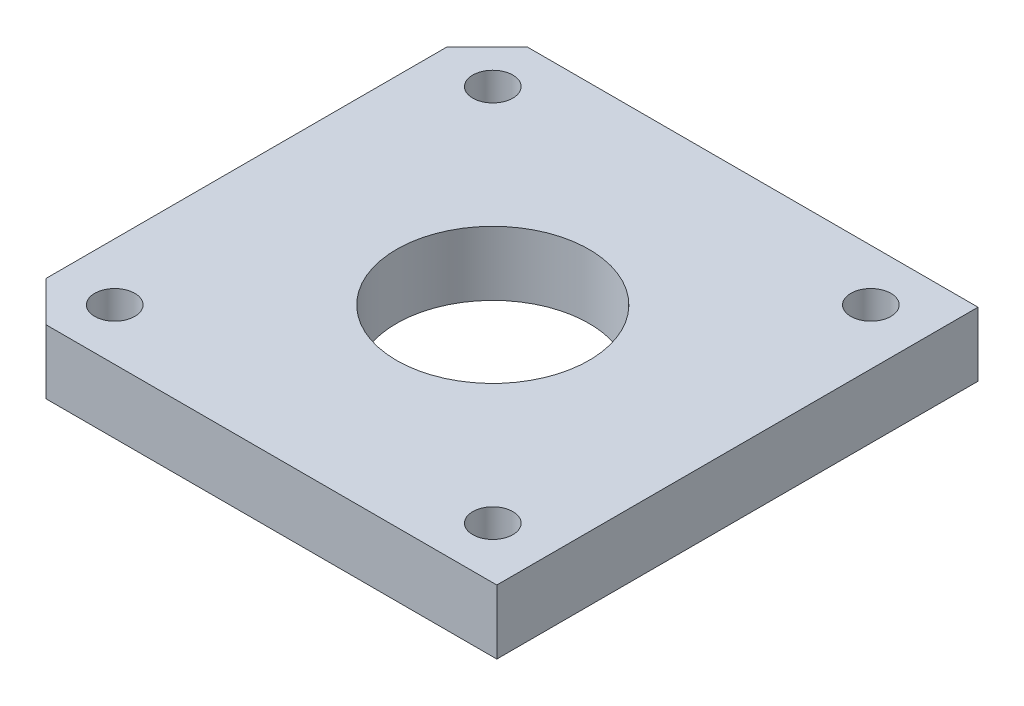
ISO-10303-21;
HEADER;
FILE_DESCRIPTION(('STEP AP214'),'2;1');
FILE_NAME('part.step','',(''),(''),'','','');
FILE_SCHEMA(('AUTOMOTIVE_DESIGN { 1 0 10303 214 1 1 1 1 }'));
ENDSEC;
DATA;
#1=APPLICATION_CONTEXT('core data for automotive mechanical design processes');
#2=APPLICATION_PROTOCOL_DEFINITION('international standard','automotive_design',2000,#1);
#3=PRODUCT_CONTEXT('',#1,'mechanical');
#4=PRODUCT('Part','Part','',(#3));
#5=PRODUCT_RELATED_PRODUCT_CATEGORY('part','',(#4));
#6=PRODUCT_DEFINITION_FORMATION('','',#4);
#7=PRODUCT_DEFINITION_CONTEXT('part definition',#1,'design');
#8=PRODUCT_DEFINITION('design','',#6,#7);
#9=PRODUCT_DEFINITION_SHAPE('','',#8);
#10=(LENGTH_UNIT() NAMED_UNIT(*) SI_UNIT(.MILLI.,.METRE.));
#11=(NAMED_UNIT(*) PLANE_ANGLE_UNIT() SI_UNIT($,.RADIAN.));
#12=(NAMED_UNIT(*) SI_UNIT($,.STERADIAN.) SOLID_ANGLE_UNIT());
#13=UNCERTAINTY_MEASURE_WITH_UNIT(LENGTH_MEASURE(1.E-05),#10,'distance_accuracy_value','');
#14=(GEOMETRIC_REPRESENTATION_CONTEXT(3) GLOBAL_UNCERTAINTY_ASSIGNED_CONTEXT((#13)) GLOBAL_UNIT_ASSIGNED_CONTEXT((#10,
#11,#12)) REPRESENTATION_CONTEXT('',''));
#15=CARTESIAN_POINT('',(0.,0.,0.));
#16=DIRECTION('',(0.,0.,1.));
#17=DIRECTION('',(1.,0.,0.));
#18=AXIS2_PLACEMENT_3D('',#15,#16,#17);
#19=CARTESIAN_POINT('',(42.5,8.,30.));
#20=DIRECTION('',(-1.,0.,0.));
#21=DIRECTION('',(0.,0.,1.));
#22=AXIS2_PLACEMENT_3D('',#19,#20,#21);
#23=PLANE('',#22);
#24=DIRECTION('',(0.,0.,-1.));
#25=VECTOR('',#24,1.);
#26=CARTESIAN_POINT('',(42.5,0.,30.));
#27=LINE('',#26,#25);
#28=CARTESIAN_POINT('',(42.5,0.,30.));
#29=VERTEX_POINT('',#28);
#30=CARTESIAN_POINT('',(42.5,0.,-30.));
#31=VERTEX_POINT('',#30);
#32=EDGE_CURVE('E103',#29,#31,#27,.T.);
#33=ORIENTED_EDGE('',*,*,#32,.T.);
#34=DIRECTION('',(0.,-1.,0.));
#35=VECTOR('',#34,1.);
#36=CARTESIAN_POINT('',(42.5,8.,-30.));
#37=LINE('',#36,#35);
#38=CARTESIAN_POINT('',(42.5,8.,-30.));
#39=VERTEX_POINT('',#38);
#40=EDGE_CURVE('E88',#39,#31,#37,.T.);
#41=ORIENTED_EDGE('',*,*,#40,.F.);
#42=DIRECTION('',(0.,0.,-1.));
#43=VECTOR('',#42,1.);
#44=CARTESIAN_POINT('',(42.5,8.,30.));
#45=LINE('',#44,#43);
#46=CARTESIAN_POINT('',(42.5,8.,30.));
#47=VERTEX_POINT('',#46);
#48=EDGE_CURVE('E92',#47,#39,#45,.T.);
#49=ORIENTED_EDGE('',*,*,#48,.F.);
#50=DIRECTION('',(0.,-1.,0.));
#51=VECTOR('',#50,1.);
#52=CARTESIAN_POINT('',(42.5,8.,30.));
#53=LINE('',#52,#51);
#54=EDGE_CURVE('E105',#47,#29,#53,.T.);
#55=ORIENTED_EDGE('',*,*,#54,.T.);
#56=EDGE_LOOP('',(#33,#41,#49,#55));
#57=FACE_BOUND('',#56,.T.);
#58=ADVANCED_FACE('F31',(#57),#23,.F.);
#59=CARTESIAN_POINT('',(-18.7102306116545,8.,-30.));
#60=DIRECTION('',(0.,0.,1.));
#61=DIRECTION('',(1.,0.,0.));
#62=AXIS2_PLACEMENT_3D('',#59,#60,#61);
#63=PLANE('',#62);
#64=DIRECTION('',(-1.,0.,0.));
#65=VECTOR('',#64,1.);
#66=CARTESIAN_POINT('',(-18.7102306116545,0.,-30.));
#67=LINE('',#66,#65);
#68=CARTESIAN_POINT('',(-13.7102306116545,0.,-30.));
#69=VERTEX_POINT('',#68);
#70=EDGE_CURVE('E131',#31,#69,#67,.T.);
#71=ORIENTED_EDGE('',*,*,#70,.T.);
#72=DIRECTION('',(0.,1.,0.));
#73=VECTOR('',#72,1.);
#74=CARTESIAN_POINT('',(-13.7102306116545,8.,-30.));
#75=LINE('',#74,#73);
#76=CARTESIAN_POINT('',(-13.7102306116545,8.,-30.));
#77=VERTEX_POINT('',#76);
#78=EDGE_CURVE('E54',#69,#77,#75,.T.);
#79=ORIENTED_EDGE('',*,*,#78,.T.);
#80=DIRECTION('',(-1.,0.,0.));
#81=VECTOR('',#80,1.);
#82=CARTESIAN_POINT('',(-18.7102306116545,8.,-30.));
#83=LINE('',#82,#81);
#84=EDGE_CURVE('E84',#39,#77,#83,.T.);
#85=ORIENTED_EDGE('',*,*,#84,.F.);
#86=ORIENTED_EDGE('',*,*,#40,.T.);
#87=EDGE_LOOP('',(#71,#79,#85,#86));
#88=FACE_BOUND('',#87,.T.);
#89=ADVANCED_FACE('F86',(#88),#63,.F.);
#90=CARTESIAN_POINT('',(-18.7102306116545,8.,30.));
#91=DIRECTION('',(1.,0.,0.));
#92=DIRECTION('',(0.,0.,-1.));
#93=AXIS2_PLACEMENT_3D('',#90,#91,#92);
#94=PLANE('',#93);
#95=DIRECTION('',(0.,0.,1.));
#96=VECTOR('',#95,1.);
#97=CARTESIAN_POINT('',(-18.7102306116545,8.,30.));
#98=LINE('',#97,#96);
#99=CARTESIAN_POINT('',(-18.7102306116545,8.,-25.));
#100=VERTEX_POINT('',#99);
#101=CARTESIAN_POINT('',(-18.7102306116545,8.,25.));
#102=VERTEX_POINT('',#101);
#103=EDGE_CURVE('E91',#100,#102,#98,.T.);
#104=ORIENTED_EDGE('',*,*,#103,.F.);
#105=DIRECTION('',(0.,-1.,0.));
#106=VECTOR('',#105,1.);
#107=CARTESIAN_POINT('',(-18.7102306116545,8.,-25.));
#108=LINE('',#107,#106);
#109=CARTESIAN_POINT('',(-18.7102306116545,0.,-25.));
#110=VERTEX_POINT('',#109);
#111=EDGE_CURVE('E107',#100,#110,#108,.T.);
#112=ORIENTED_EDGE('',*,*,#111,.T.);
#113=DIRECTION('',(0.,0.,1.));
#114=VECTOR('',#113,1.);
#115=CARTESIAN_POINT('',(-18.7102306116545,0.,30.));
#116=LINE('',#115,#114);
#117=CARTESIAN_POINT('',(-18.7102306116545,0.,25.));
#118=VERTEX_POINT('',#117);
#119=EDGE_CURVE('E132',#110,#118,#116,.T.);
#120=ORIENTED_EDGE('',*,*,#119,.T.);
#121=DIRECTION('',(0.,1.,0.));
#122=VECTOR('',#121,1.);
#123=CARTESIAN_POINT('',(-18.7102306116545,8.,25.));
#124=LINE('',#123,#122);
#125=EDGE_CURVE('E104',#118,#102,#124,.T.);
#126=ORIENTED_EDGE('',*,*,#125,.T.);
#127=EDGE_LOOP('',(#104,#112,#120,#126));
#128=FACE_BOUND('',#127,.T.);
#129=ADVANCED_FACE('F123',(#128),#94,.F.);
#130=CARTESIAN_POINT('',(-18.7102306116545,8.,30.));
#131=DIRECTION('',(0.,0.,-1.));
#132=DIRECTION('',(-1.,0.,0.));
#133=AXIS2_PLACEMENT_3D('',#130,#131,#132);
#134=PLANE('',#133);
#135=DIRECTION('',(1.,0.,0.));
#136=VECTOR('',#135,1.);
#137=CARTESIAN_POINT('',(-18.7102306116545,8.,30.));
#138=LINE('',#137,#136);
#139=CARTESIAN_POINT('',(-13.7102306116545,8.,30.));
#140=VERTEX_POINT('',#139);
#141=EDGE_CURVE('E96',#140,#47,#138,.T.);
#142=ORIENTED_EDGE('',*,*,#141,.F.);
#143=DIRECTION('',(0.,-1.,0.));
#144=VECTOR('',#143,1.);
#145=CARTESIAN_POINT('',(-13.7102306116545,8.,30.));
#146=LINE('',#145,#144);
#147=CARTESIAN_POINT('',(-13.7102306116545,0.,30.));
#148=VERTEX_POINT('',#147);
#149=EDGE_CURVE('E11',#140,#148,#146,.T.);
#150=ORIENTED_EDGE('',*,*,#149,.T.);
#151=DIRECTION('',(1.,0.,0.));
#152=VECTOR('',#151,1.);
#153=CARTESIAN_POINT('',(-18.7102306116545,0.,30.));
#154=LINE('',#153,#152);
#155=EDGE_CURVE('E100',#148,#29,#154,.T.);
#156=ORIENTED_EDGE('',*,*,#155,.T.);
#157=ORIENTED_EDGE('',*,*,#54,.F.);
#158=EDGE_LOOP('',(#142,#150,#156,#157));
#159=FACE_BOUND('',#158,.T.);
#160=ADVANCED_FACE('F140',(#159),#134,.F.);
#161=CARTESIAN_POINT('',(42.5,8.,-30.));
#162=DIRECTION('',(0.,-1.,0.));
#163=DIRECTION('',(0.,0.,-1.));
#164=AXIS2_PLACEMENT_3D('',#161,#162,#163);
#165=PLANE('',#164);
#166=CARTESIAN_POINT('',(35.57,8.,23.57));
#167=DIRECTION('',(0.,1.,0.));
#168=DIRECTION('',(0.,0.,1.));
#169=AXIS2_PLACEMENT_3D('',#166,#167,#168);
#170=CIRCLE('',#169,2.49999999999999);
#171=CARTESIAN_POINT('',(35.57,8.,26.07));
#172=VERTEX_POINT('',#171);
#173=EDGE_CURVE('E191',#172,#172,#170,.T.);
#174=ORIENTED_EDGE('',*,*,#173,.F.);
#175=EDGE_LOOP('',(#174));
#176=FACE_BOUND('',#175,.T.);
#177=CARTESIAN_POINT('',(-11.57,8.,23.57));
#178=DIRECTION('',(0.,1.,0.));
#179=DIRECTION('',(0.,0.,1.));
#180=AXIS2_PLACEMENT_3D('',#177,#178,#179);
#181=CIRCLE('',#180,2.5);
#182=CARTESIAN_POINT('',(-11.57,8.,26.07));
#183=VERTEX_POINT('',#182);
#184=EDGE_CURVE('E193',#183,#183,#181,.T.);
#185=ORIENTED_EDGE('',*,*,#184,.F.);
#186=EDGE_LOOP('',(#185));
#187=FACE_BOUND('',#186,.T.);
#188=CARTESIAN_POINT('',(35.57,8.,-23.57));
#189=DIRECTION('',(0.,1.,0.));
#190=DIRECTION('',(0.,0.,1.));
#191=AXIS2_PLACEMENT_3D('',#188,#189,#190);
#192=CIRCLE('',#191,2.49999999999999);
#193=CARTESIAN_POINT('',(35.57,8.,-21.07));
#194=VERTEX_POINT('',#193);
#195=EDGE_CURVE('E199',#194,#194,#192,.T.);
#196=ORIENTED_EDGE('',*,*,#195,.F.);
#197=EDGE_LOOP('',(#196));
#198=FACE_BOUND('',#197,.T.);
#199=CARTESIAN_POINT('',(-11.57,8.,-23.57));
#200=DIRECTION('',(0.,1.,0.));
#201=DIRECTION('',(0.,0.,1.));
#202=AXIS2_PLACEMENT_3D('',#199,#200,#201);
#203=CIRCLE('',#202,2.5);
#204=CARTESIAN_POINT('',(-11.57,8.,-21.07));
#205=VERTEX_POINT('',#204);
#206=EDGE_CURVE('E205',#205,#205,#203,.T.);
#207=ORIENTED_EDGE('',*,*,#206,.F.);
#208=EDGE_LOOP('',(#207));
#209=FACE_BOUND('',#208,.T.);
#210=CARTESIAN_POINT('',(12.,8.,0.));
#211=DIRECTION('',(0.,1.,0.));
#212=DIRECTION('',(0.,0.,1.));
#213=AXIS2_PLACEMENT_3D('',#210,#211,#212);
#214=CIRCLE('',#213,12.);
#215=CARTESIAN_POINT('',(12.,8.,12.));
#216=VERTEX_POINT('',#215);
#217=EDGE_CURVE('E211',#216,#216,#214,.T.);
#218=ORIENTED_EDGE('',*,*,#217,.F.);
#219=EDGE_LOOP('',(#218));
#220=FACE_BOUND('',#219,.T.);
#221=ORIENTED_EDGE('',*,*,#84,.T.);
#222=DIRECTION('',(0.707106781186549,0.,-0.707106781186546));
#223=VECTOR('',#222,1.);
#224=CARTESIAN_POINT('',(-18.7102306116545,8.,-25.));
#225=LINE('',#224,#223);
#226=EDGE_CURVE('E39',#77,#100,#225,.F.);
#227=ORIENTED_EDGE('',*,*,#226,.T.);
#228=ORIENTED_EDGE('',*,*,#103,.T.);
#229=DIRECTION('',(-0.707106781186546,0.,-0.707106781186549));
#230=VECTOR('',#229,1.);
#231=CARTESIAN_POINT('',(-13.7102306116545,8.,30.));
#232=LINE('',#231,#230);
#233=EDGE_CURVE('E46',#102,#140,#232,.F.);
#234=ORIENTED_EDGE('',*,*,#233,.T.);
#235=ORIENTED_EDGE('',*,*,#141,.T.);
#236=ORIENTED_EDGE('',*,*,#48,.T.);
#237=EDGE_LOOP('',(#221,#227,#228,#234,#235,#236));
#238=FACE_BOUND('',#237,.T.);
#239=ADVANCED_FACE('F95',(#176,#187,#198,#209,#220,#238),#165,.F.);
#240=CARTESIAN_POINT('',(42.5,0.,-30.));
#241=DIRECTION('',(0.,-1.,0.));
#242=DIRECTION('',(0.,0.,-1.));
#243=AXIS2_PLACEMENT_3D('',#240,#241,#242);
#244=PLANE('',#243);
#245=CARTESIAN_POINT('',(35.57,0.,23.57));
#246=DIRECTION('',(0.,1.,0.));
#247=DIRECTION('',(0.,0.,1.));
#248=AXIS2_PLACEMENT_3D('',#245,#246,#247);
#249=CIRCLE('',#248,2.49999999999999);
#250=CARTESIAN_POINT('',(35.57,0.,26.07));
#251=VERTEX_POINT('',#250);
#252=EDGE_CURVE('E188',#251,#251,#249,.T.);
#253=ORIENTED_EDGE('',*,*,#252,.T.);
#254=EDGE_LOOP('',(#253));
#255=FACE_BOUND('',#254,.T.);
#256=CARTESIAN_POINT('',(-11.57,0.,23.57));
#257=DIRECTION('',(0.,1.,0.));
#258=DIRECTION('',(0.,0.,1.));
#259=AXIS2_PLACEMENT_3D('',#256,#257,#258);
#260=CIRCLE('',#259,2.5);
#261=CARTESIAN_POINT('',(-11.57,0.,26.07));
#262=VERTEX_POINT('',#261);
#263=EDGE_CURVE('E196',#262,#262,#260,.T.);
#264=ORIENTED_EDGE('',*,*,#263,.T.);
#265=EDGE_LOOP('',(#264));
#266=FACE_BOUND('',#265,.T.);
#267=CARTESIAN_POINT('',(35.57,0.,-23.57));
#268=DIRECTION('',(0.,1.,0.));
#269=DIRECTION('',(0.,0.,1.));
#270=AXIS2_PLACEMENT_3D('',#267,#268,#269);
#271=CIRCLE('',#270,2.49999999999999);
#272=CARTESIAN_POINT('',(35.57,0.,-21.07));
#273=VERTEX_POINT('',#272);
#274=EDGE_CURVE('E202',#273,#273,#271,.T.);
#275=ORIENTED_EDGE('',*,*,#274,.T.);
#276=EDGE_LOOP('',(#275));
#277=FACE_BOUND('',#276,.T.);
#278=CARTESIAN_POINT('',(-11.57,0.,-23.57));
#279=DIRECTION('',(0.,1.,0.));
#280=DIRECTION('',(0.,0.,1.));
#281=AXIS2_PLACEMENT_3D('',#278,#279,#280);
#282=CIRCLE('',#281,2.5);
#283=CARTESIAN_POINT('',(-11.57,0.,-21.07));
#284=VERTEX_POINT('',#283);
#285=EDGE_CURVE('E208',#284,#284,#282,.T.);
#286=ORIENTED_EDGE('',*,*,#285,.T.);
#287=EDGE_LOOP('',(#286));
#288=FACE_BOUND('',#287,.T.);
#289=CARTESIAN_POINT('',(12.,0.,0.));
#290=DIRECTION('',(0.,1.,0.));
#291=DIRECTION('',(0.,0.,1.));
#292=AXIS2_PLACEMENT_3D('',#289,#290,#291);
#293=CIRCLE('',#292,12.);
#294=CARTESIAN_POINT('',(12.,0.,12.));
#295=VERTEX_POINT('',#294);
#296=EDGE_CURVE('E135',#295,#295,#293,.T.);
#297=ORIENTED_EDGE('',*,*,#296,.T.);
#298=EDGE_LOOP('',(#297));
#299=FACE_BOUND('',#298,.T.);
#300=ORIENTED_EDGE('',*,*,#119,.F.);
#301=DIRECTION('',(-0.707106781186549,0.,0.707106781186546));
#302=VECTOR('',#301,1.);
#303=CARTESIAN_POINT('',(14.3948846941728,0.,-58.1051153058273));
#304=LINE('',#303,#302);
#305=EDGE_CURVE('E116',#110,#69,#304,.F.);
#306=ORIENTED_EDGE('',*,*,#305,.T.);
#307=ORIENTED_EDGE('',*,*,#70,.F.);
#308=ORIENTED_EDGE('',*,*,#32,.F.);
#309=ORIENTED_EDGE('',*,*,#155,.F.);
#310=DIRECTION('',(0.707106781186546,0.,0.707106781186549));
#311=VECTOR('',#310,1.);
#312=CARTESIAN_POINT('',(-15.6051153058274,0.,28.1051153058271));
#313=LINE('',#312,#311);
#314=EDGE_CURVE('E114',#148,#118,#313,.F.);
#315=ORIENTED_EDGE('',*,*,#314,.T.);
#316=EDGE_LOOP('',(#300,#306,#307,#308,#309,#315));
#317=FACE_BOUND('',#316,.T.);
#318=ADVANCED_FACE('F130',(#255,#266,#277,#288,#299,#317),#244,.T.);
#319=CARTESIAN_POINT('',(-18.7102306116545,8.,-25.));
#320=DIRECTION('',(0.707106781186546,0.,0.707106781186549));
#321=DIRECTION('',(0.707106781186549,0.,-0.707106781186546));
#322=AXIS2_PLACEMENT_3D('',#319,#320,#321);
#323=PLANE('',#322);
#324=ORIENTED_EDGE('',*,*,#226,.F.);
#325=ORIENTED_EDGE('',*,*,#78,.F.);
#326=ORIENTED_EDGE('',*,*,#305,.F.);
#327=ORIENTED_EDGE('',*,*,#111,.F.);
#328=EDGE_LOOP('',(#324,#325,#326,#327));
#329=FACE_BOUND('',#328,.T.);
#330=ADVANCED_FACE('F128',(#329),#323,.F.);
#331=CARTESIAN_POINT('',(-13.7102306116545,8.,30.));
#332=DIRECTION('',(0.707106781186549,0.,-0.707106781186546));
#333=DIRECTION('',(-0.707106781186546,0.,-0.707106781186549));
#334=AXIS2_PLACEMENT_3D('',#331,#332,#333);
#335=PLANE('',#334);
#336=ORIENTED_EDGE('',*,*,#233,.F.);
#337=ORIENTED_EDGE('',*,*,#125,.F.);
#338=ORIENTED_EDGE('',*,*,#314,.F.);
#339=ORIENTED_EDGE('',*,*,#149,.F.);
#340=EDGE_LOOP('',(#336,#337,#338,#339));
#341=FACE_BOUND('',#340,.T.);
#342=ADVANCED_FACE('F33',(#341),#335,.F.);
#343=CARTESIAN_POINT('',(12.,0.,0.));
#344=DIRECTION('',(0.,1.,0.));
#345=DIRECTION('',(0.,0.,1.));
#346=AXIS2_PLACEMENT_3D('',#343,#344,#345);
#347=CYLINDRICAL_SURFACE('',#346,12.);
#348=ORIENTED_EDGE('',*,*,#296,.F.);
#349=EDGE_LOOP('',(#348));
#350=FACE_BOUND('',#349,.T.);
#351=ORIENTED_EDGE('',*,*,#217,.T.);
#352=EDGE_LOOP('',(#351));
#353=FACE_BOUND('',#352,.T.);
#354=ADVANCED_FACE('F144',(#350,#353),#347,.F.);
#355=CARTESIAN_POINT('',(-11.57,0.,-23.57));
#356=DIRECTION('',(0.,1.,0.));
#357=DIRECTION('',(0.,0.,1.));
#358=AXIS2_PLACEMENT_3D('',#355,#356,#357);
#359=CYLINDRICAL_SURFACE('',#358,2.5);
#360=ORIENTED_EDGE('',*,*,#285,.F.);
#361=EDGE_LOOP('',(#360));
#362=FACE_BOUND('',#361,.T.);
#363=ORIENTED_EDGE('',*,*,#206,.T.);
#364=EDGE_LOOP('',(#363));
#365=FACE_BOUND('',#364,.T.);
#366=ADVANCED_FACE('F149',(#362,#365),#359,.F.);
#367=CARTESIAN_POINT('',(35.57,0.,-23.57));
#368=DIRECTION('',(0.,1.,0.));
#369=DIRECTION('',(0.,0.,1.));
#370=AXIS2_PLACEMENT_3D('',#367,#368,#369);
#371=CYLINDRICAL_SURFACE('',#370,2.49999999999999);
#372=ORIENTED_EDGE('',*,*,#274,.F.);
#373=EDGE_LOOP('',(#372));
#374=FACE_BOUND('',#373,.T.);
#375=ORIENTED_EDGE('',*,*,#195,.T.);
#376=EDGE_LOOP('',(#375));
#377=FACE_BOUND('',#376,.T.);
#378=ADVANCED_FACE('F171',(#374,#377),#371,.F.);
#379=CARTESIAN_POINT('',(-11.57,0.,23.57));
#380=DIRECTION('',(0.,1.,0.));
#381=DIRECTION('',(0.,0.,1.));
#382=AXIS2_PLACEMENT_3D('',#379,#380,#381);
#383=CYLINDRICAL_SURFACE('',#382,2.5);
#384=ORIENTED_EDGE('',*,*,#263,.F.);
#385=EDGE_LOOP('',(#384));
#386=FACE_BOUND('',#385,.T.);
#387=ORIENTED_EDGE('',*,*,#184,.T.);
#388=EDGE_LOOP('',(#387));
#389=FACE_BOUND('',#388,.T.);
#390=ADVANCED_FACE('F175',(#386,#389),#383,.F.);
#391=CARTESIAN_POINT('',(35.57,0.,23.57));
#392=DIRECTION('',(0.,1.,0.));
#393=DIRECTION('',(0.,0.,1.));
#394=AXIS2_PLACEMENT_3D('',#391,#392,#393);
#395=CYLINDRICAL_SURFACE('',#394,2.49999999999999);
#396=ORIENTED_EDGE('',*,*,#252,.F.);
#397=EDGE_LOOP('',(#396));
#398=FACE_BOUND('',#397,.T.);
#399=ORIENTED_EDGE('',*,*,#173,.T.);
#400=EDGE_LOOP('',(#399));
#401=FACE_BOUND('',#400,.T.);
#402=ADVANCED_FACE('F179',(#398,#401),#395,.F.);
#403=CLOSED_SHELL('',(#58,#89,#129,#160,#239,#318,#330,#342,#354,#366,#378,#390,#402));
#404=MANIFOLD_SOLID_BREP('B2',#403);
#405=ADVANCED_BREP_SHAPE_REPRESENTATION('',(#18,#404),#14);
#406=SHAPE_DEFINITION_REPRESENTATION(#9,#405);
ENDSEC;
END-ISO-10303-21;
